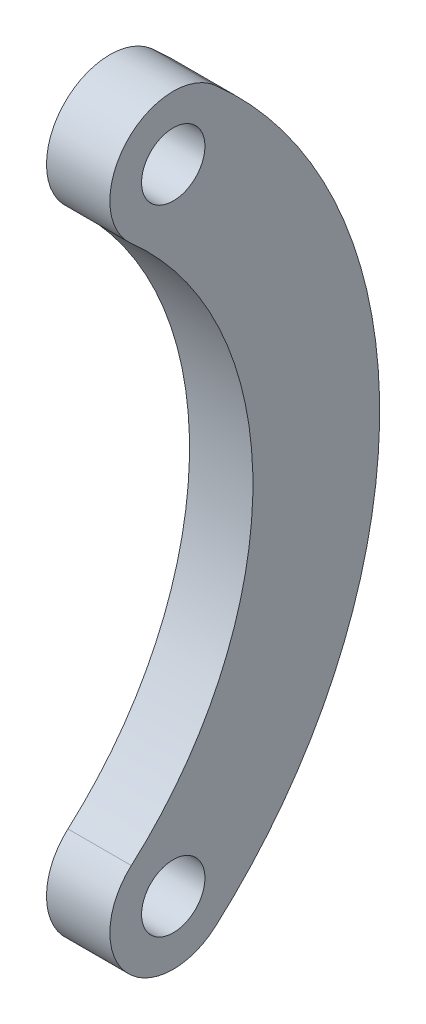
ISO-10303-21;
HEADER;
FILE_DESCRIPTION(('STEP AP214'),'2;1');
FILE_NAME('part.step','',(''),(''),'','','');
FILE_SCHEMA(('AUTOMOTIVE_DESIGN { 1 0 10303 214 1 1 1 1 }'));
ENDSEC;
DATA;
#1=APPLICATION_CONTEXT('core data for automotive mechanical design processes');
#2=APPLICATION_PROTOCOL_DEFINITION('international standard','automotive_design',2000,#1);
#3=PRODUCT_CONTEXT('',#1,'mechanical');
#4=PRODUCT('Part','Part','',(#3));
#5=PRODUCT_RELATED_PRODUCT_CATEGORY('part','',(#4));
#6=PRODUCT_DEFINITION_FORMATION('','',#4);
#7=PRODUCT_DEFINITION_CONTEXT('part definition',#1,'design');
#8=PRODUCT_DEFINITION('design','',#6,#7);
#9=PRODUCT_DEFINITION_SHAPE('','',#8);
#10=(LENGTH_UNIT() NAMED_UNIT(*) SI_UNIT(.MILLI.,.METRE.));
#11=(NAMED_UNIT(*) PLANE_ANGLE_UNIT() SI_UNIT($,.RADIAN.));
#12=(NAMED_UNIT(*) SI_UNIT($,.STERADIAN.) SOLID_ANGLE_UNIT());
#13=UNCERTAINTY_MEASURE_WITH_UNIT(LENGTH_MEASURE(1.E-05),#10,'distance_accuracy_value','');
#14=(GEOMETRIC_REPRESENTATION_CONTEXT(3) GLOBAL_UNCERTAINTY_ASSIGNED_CONTEXT((#13)) GLOBAL_UNIT_ASSIGNED_CONTEXT((#10,
#11,#12)) REPRESENTATION_CONTEXT('',''));
#15=CARTESIAN_POINT('',(0.,0.,0.));
#16=DIRECTION('',(0.,0.,1.));
#17=DIRECTION('',(1.,0.,0.));
#18=AXIS2_PLACEMENT_3D('',#15,#16,#17);
#19=CARTESIAN_POINT('',(19.05,0.,0.));
#20=DIRECTION('',(-1.,0.,0.));
#21=DIRECTION('',(0.,0.,1.));
#22=AXIS2_PLACEMENT_3D('',#19,#20,#21);
#23=CYLINDRICAL_SURFACE('',#22,146.05);
#24=CARTESIAN_POINT('',(0.,0.,0.));
#25=DIRECTION('',(1.,0.,0.));
#26=DIRECTION('',(0.,0.,-1.));
#27=AXIS2_PLACEMENT_3D('',#24,#25,#26);
#28=CIRCLE('',#27,146.05);
#29=CARTESIAN_POINT('',(0.,109.5375,-96.6029947452458));
#30=VERTEX_POINT('',#29);
#31=CARTESIAN_POINT('',(0.,-109.5375,-96.6029947452459));
#32=VERTEX_POINT('',#31);
#33=EDGE_CURVE('E122',#30,#32,#28,.F.);
#34=ORIENTED_EDGE('',*,*,#33,.F.);
#35=DIRECTION('',(-1.,0.,0.));
#36=VECTOR('',#35,1.);
#37=CARTESIAN_POINT('',(19.05,109.5375,-96.6029947452458));
#38=LINE('',#37,#36);
#39=CARTESIAN_POINT('',(19.05,109.5375,-96.6029947452458));
#40=VERTEX_POINT('',#39);
#41=EDGE_CURVE('E11',#40,#30,#38,.T.);
#42=ORIENTED_EDGE('',*,*,#41,.F.);
#43=CARTESIAN_POINT('',(19.05,0.,0.));
#44=DIRECTION('',(1.,0.,0.));
#45=DIRECTION('',(0.,0.,-1.));
#46=AXIS2_PLACEMENT_3D('',#43,#44,#45);
#47=CIRCLE('',#46,146.05);
#48=CARTESIAN_POINT('',(19.05,-109.5375,-96.6029947452459));
#49=VERTEX_POINT('',#48);
#50=EDGE_CURVE('E95',#40,#49,#47,.F.);
#51=ORIENTED_EDGE('',*,*,#50,.T.);
#52=DIRECTION('',(-1.,0.,0.));
#53=VECTOR('',#52,1.);
#54=CARTESIAN_POINT('',(19.05,-109.5375,-96.6029947452459));
#55=LINE('',#54,#53);
#56=EDGE_CURVE('E62',#49,#32,#55,.T.);
#57=ORIENTED_EDGE('',*,*,#56,.T.);
#58=EDGE_LOOP('',(#34,#42,#51,#57));
#59=FACE_BOUND('',#58,.T.);
#60=ADVANCED_FACE('F45',(#59),#23,.T.);
#61=CARTESIAN_POINT('',(19.05,95.25,-84.0026041263008));
#62=DIRECTION('',(-1.,0.,0.));
#63=DIRECTION('',(0.,0.,1.));
#64=AXIS2_PLACEMENT_3D('',#61,#62,#63);
#65=CYLINDRICAL_SURFACE('',#64,19.05);
#66=CARTESIAN_POINT('',(0.,95.25,-84.0026041263008));
#67=DIRECTION('',(1.,0.,0.));
#68=DIRECTION('',(0.,0.,-1.));
#69=AXIS2_PLACEMENT_3D('',#66,#67,#68);
#70=CIRCLE('',#69,19.05);
#71=CARTESIAN_POINT('',(0.,80.9625,-71.4022135073556));
#72=VERTEX_POINT('',#71);
#73=EDGE_CURVE('E102',#30,#72,#70,.T.);
#74=ORIENTED_EDGE('',*,*,#73,.T.);
#75=DIRECTION('',(-1.,0.,0.));
#76=VECTOR('',#75,1.);
#77=CARTESIAN_POINT('',(19.05,80.9625,-71.4022135073556));
#78=LINE('',#77,#76);
#79=CARTESIAN_POINT('',(19.05,80.9625,-71.4022135073556));
#80=VERTEX_POINT('',#79);
#81=EDGE_CURVE('E54',#80,#72,#78,.T.);
#82=ORIENTED_EDGE('',*,*,#81,.F.);
#83=CARTESIAN_POINT('',(19.05,95.25,-84.0026041263008));
#84=DIRECTION('',(1.,0.,0.));
#85=DIRECTION('',(0.,0.,-1.));
#86=AXIS2_PLACEMENT_3D('',#83,#84,#85);
#87=CIRCLE('',#86,19.05);
#88=EDGE_CURVE('E88',#40,#80,#87,.T.);
#89=ORIENTED_EDGE('',*,*,#88,.F.);
#90=ORIENTED_EDGE('',*,*,#41,.T.);
#91=EDGE_LOOP('',(#74,#82,#89,#90));
#92=FACE_BOUND('',#91,.T.);
#93=ADVANCED_FACE('F100',(#92),#65,.T.);
#94=CARTESIAN_POINT('',(19.05,0.,0.));
#95=DIRECTION('',(-1.,0.,0.));
#96=DIRECTION('',(0.,0.,1.));
#97=AXIS2_PLACEMENT_3D('',#94,#95,#96);
#98=CYLINDRICAL_SURFACE('',#97,107.95);
#99=CARTESIAN_POINT('',(0.,0.,0.));
#100=DIRECTION('',(1.,0.,0.));
#101=DIRECTION('',(0.,0.,-1.));
#102=AXIS2_PLACEMENT_3D('',#99,#100,#101);
#103=CIRCLE('',#102,107.95);
#104=CARTESIAN_POINT('',(0.,-80.9625,-71.4022135073557));
#105=VERTEX_POINT('',#104);
#106=EDGE_CURVE('E127',#72,#105,#103,.F.);
#107=ORIENTED_EDGE('',*,*,#106,.T.);
#108=DIRECTION('',(-1.,0.,0.));
#109=VECTOR('',#108,1.);
#110=CARTESIAN_POINT('',(19.05,-80.9625,-71.4022135073557));
#111=LINE('',#110,#109);
#112=CARTESIAN_POINT('',(19.05,-80.9625,-71.4022135073557));
#113=VERTEX_POINT('',#112);
#114=EDGE_CURVE('E76',#113,#105,#111,.T.);
#115=ORIENTED_EDGE('',*,*,#114,.F.);
#116=CARTESIAN_POINT('',(19.05,0.,0.));
#117=DIRECTION('',(1.,0.,0.));
#118=DIRECTION('',(0.,0.,-1.));
#119=AXIS2_PLACEMENT_3D('',#116,#117,#118);
#120=CIRCLE('',#119,107.95);
#121=EDGE_CURVE('E94',#80,#113,#120,.F.);
#122=ORIENTED_EDGE('',*,*,#121,.F.);
#123=ORIENTED_EDGE('',*,*,#81,.T.);
#124=EDGE_LOOP('',(#107,#115,#122,#123));
#125=FACE_BOUND('',#124,.T.);
#126=ADVANCED_FACE('F106',(#125),#98,.F.);
#127=CARTESIAN_POINT('',(19.05,-95.25,-84.0026041263008));
#128=DIRECTION('',(-1.,0.,0.));
#129=DIRECTION('',(0.,0.,1.));
#130=AXIS2_PLACEMENT_3D('',#127,#128,#129);
#131=CYLINDRICAL_SURFACE('',#130,9.52500000000001);
#132=CARTESIAN_POINT('',(19.05,-95.25,-84.0026041263008));
#133=DIRECTION('',(1.,0.,0.));
#134=DIRECTION('',(0.,0.,-1.));
#135=AXIS2_PLACEMENT_3D('',#132,#133,#134);
#136=CIRCLE('',#135,9.52500000000001);
#137=CARTESIAN_POINT('',(19.05,-95.25,-74.4776041263007));
#138=VERTEX_POINT('',#137);
#139=EDGE_CURVE('E111',#138,#138,#136,.T.);
#140=CARTESIAN_POINT('',(0.,-95.25,-84.0026041263008));
#141=DIRECTION('',(1.,0.,0.));
#142=DIRECTION('',(0.,0.,-1.));
#143=AXIS2_PLACEMENT_3D('',#140,#141,#142);
#144=CIRCLE('',#143,9.52500000000001);
#145=CARTESIAN_POINT('',(0.,-95.25,-74.4776041263007));
#146=VERTEX_POINT('',#145);
#147=EDGE_CURVE('E134',#146,#146,#144,.T.);
#148=CARTESIAN_POINT('',(19.05,-95.25,-74.4776041263007));
#149=CARTESIAN_POINT('',(18.8515625,-95.25,-74.4776041263007));
#150=CARTESIAN_POINT('',(18.653125,-95.25,-74.4776041263007));
#151=CARTESIAN_POINT('',(18.25625,-95.25,-74.4776041263007));
#152=CARTESIAN_POINT('',(18.0578125,-95.25,-74.4776041263007));
#153=CARTESIAN_POINT('',(17.6609375,-95.25,-74.4776041263007));
#154=CARTESIAN_POINT('',(17.4625,-95.25,-74.4776041263007));
#155=CARTESIAN_POINT('',(17.065625,-95.25,-74.4776041263007));
#156=CARTESIAN_POINT('',(16.8671875,-95.25,-74.4776041263007));
#157=CARTESIAN_POINT('',(16.4703125,-95.25,-74.4776041263007));
#158=CARTESIAN_POINT('',(16.271875,-95.25,-74.4776041263007));
#159=CARTESIAN_POINT('',(15.875,-95.25,-74.4776041263007));
#160=CARTESIAN_POINT('',(15.6765625,-95.25,-74.4776041263007));
#161=CARTESIAN_POINT('',(15.2796875,-95.25,-74.4776041263007));
#162=CARTESIAN_POINT('',(15.08125,-95.25,-74.4776041263007));
#163=CARTESIAN_POINT('',(14.684375,-95.25,-74.4776041263007));
#164=CARTESIAN_POINT('',(14.4859375,-95.25,-74.4776041263007));
#165=CARTESIAN_POINT('',(14.0890625,-95.25,-74.4776041263007));
#166=CARTESIAN_POINT('',(13.890625,-95.25,-74.4776041263007));
#167=CARTESIAN_POINT('',(13.49375,-95.25,-74.4776041263007));
#168=CARTESIAN_POINT('',(13.2953125,-95.25,-74.4776041263007));
#169=CARTESIAN_POINT('',(12.8984375,-95.25,-74.4776041263007));
#170=CARTESIAN_POINT('',(12.7,-95.25,-74.4776041263007));
#171=CARTESIAN_POINT('',(12.303125,-95.25,-74.4776041263007));
#172=CARTESIAN_POINT('',(12.1046875,-95.25,-74.4776041263007));
#173=CARTESIAN_POINT('',(11.7078125,-95.25,-74.4776041263007));
#174=CARTESIAN_POINT('',(11.509375,-95.25,-74.4776041263007));
#175=CARTESIAN_POINT('',(11.1125,-95.25,-74.4776041263007));
#176=CARTESIAN_POINT('',(10.9140625,-95.25,-74.4776041263007));
#177=CARTESIAN_POINT('',(10.5171875,-95.25,-74.4776041263007));
#178=CARTESIAN_POINT('',(10.31875,-95.25,-74.4776041263007));
#179=CARTESIAN_POINT('',(9.921875,-95.25,-74.4776041263007));
#180=CARTESIAN_POINT('',(9.7234375,-95.25,-74.4776041263007));
#181=CARTESIAN_POINT('',(9.3265625,-95.25,-74.4776041263007));
#182=CARTESIAN_POINT('',(9.128125,-95.25,-74.4776041263007));
#183=CARTESIAN_POINT('',(8.73125,-95.25,-74.4776041263007));
#184=CARTESIAN_POINT('',(8.5328125,-95.25,-74.4776041263007));
#185=CARTESIAN_POINT('',(8.1359375,-95.25,-74.4776041263007));
#186=CARTESIAN_POINT('',(7.9375,-95.25,-74.4776041263007));
#187=CARTESIAN_POINT('',(7.540625,-95.25,-74.4776041263007));
#188=CARTESIAN_POINT('',(7.3421875,-95.25,-74.4776041263007));
#189=CARTESIAN_POINT('',(6.9453125,-95.25,-74.4776041263007));
#190=CARTESIAN_POINT('',(6.746875,-95.25,-74.4776041263007));
#191=CARTESIAN_POINT('',(6.35,-95.25,-74.4776041263007));
#192=CARTESIAN_POINT('',(6.1515625,-95.25,-74.4776041263007));
#193=CARTESIAN_POINT('',(5.7546875,-95.25,-74.4776041263007));
#194=CARTESIAN_POINT('',(5.55625,-95.25,-74.4776041263007));
#195=CARTESIAN_POINT('',(5.159375,-95.25,-74.4776041263007));
#196=CARTESIAN_POINT('',(4.9609375,-95.25,-74.4776041263007));
#197=CARTESIAN_POINT('',(4.5640625,-95.25,-74.4776041263007));
#198=CARTESIAN_POINT('',(4.365625,-95.25,-74.4776041263007));
#199=CARTESIAN_POINT('',(3.96875,-95.25,-74.4776041263007));
#200=CARTESIAN_POINT('',(3.7703125,-95.25,-74.4776041263007));
#201=CARTESIAN_POINT('',(3.3734375,-95.25,-74.4776041263007));
#202=CARTESIAN_POINT('',(3.175,-95.25,-74.4776041263007));
#203=CARTESIAN_POINT('',(2.778125,-95.25,-74.4776041263007));
#204=CARTESIAN_POINT('',(2.5796875,-95.25,-74.4776041263007));
#205=CARTESIAN_POINT('',(2.1828125,-95.25,-74.4776041263007));
#206=CARTESIAN_POINT('',(1.984375,-95.25,-74.4776041263007));
#207=CARTESIAN_POINT('',(1.5875,-95.25,-74.4776041263007));
#208=CARTESIAN_POINT('',(1.3890625,-95.25,-74.4776041263007));
#209=CARTESIAN_POINT('',(0.992187500000001,-95.25,-74.4776041263007));
#210=CARTESIAN_POINT('',(0.793750000000001,-95.25,-74.4776041263007));
#211=CARTESIAN_POINT('',(0.396875,-95.25,-74.4776041263007));
#212=CARTESIAN_POINT('',(0.1984375,-95.25,-74.4776041263007));
#213=CARTESIAN_POINT('',(0.,-95.25,-74.4776041263007));
#214=B_SPLINE_CURVE_WITH_KNOTS('',3,(#148,#149,#150,#151,#152,#153,#154,#155,#156,#157,#158,
#159,#160,#161,#162,#163,#164,#165,#166,#167,#168,#169,#170,#171,#172,#173,#174,#175,#176,#177,
#178,#179,#180,#181,#182,#183,#184,#185,#186,#187,#188,#189,#190,#191,#192,#193,#194,#195,#196,
#197,#198,#199,#200,#201,#202,#203,#204,#205,#206,#207,#208,#209,#210,#211,#212,#213),
.UNSPECIFIED.,.F.,.F.,(4,2,2,2,2,2,2,2,2,2,2,2,2,2,2,2,2,2,2,2,2,2,2,2,2,2,2,2,2,2,2,2,4),(0.,
0.5953125,1.190625,1.7859375,2.38125,2.9765625,3.571875,4.1671875,4.7625,5.3578125,5.953125,
6.5484375,7.14375,7.7390625,8.334375,8.9296875,9.525,10.1203125,10.715625,11.3109375,11.90625,
12.5015625,13.096875,13.6921875,14.2875,14.8828125,15.478125,16.0734375,16.66875,17.2640625,
17.859375,18.4546875,19.05),.UNSPECIFIED.);
#215=EDGE_CURVE('BSEAM151',#138,#146,#214,.T.);
#216=ORIENTED_EDGE('',*,*,#139,.T.);
#217=ORIENTED_EDGE('',*,*,#147,.F.);
#218=ORIENTED_EDGE('',*,*,#215,.T.);
#219=ORIENTED_EDGE('',*,*,#215,.F.);
#220=EDGE_LOOP('',(#216,#218,#217,#219));
#221=FACE_BOUND('',#220,.T.);
#222=ADVANCED_FACE('F151',(#221),#131,.F.);
#223=CARTESIAN_POINT('',(19.05,-95.25,-84.0026041263008));
#224=DIRECTION('',(-1.,0.,0.));
#225=DIRECTION('',(0.,0.,1.));
#226=AXIS2_PLACEMENT_3D('',#223,#224,#225);
#227=CYLINDRICAL_SURFACE('',#226,19.05);
#228=CARTESIAN_POINT('',(0.,-95.25,-84.0026041263008));
#229=DIRECTION('',(1.,0.,0.));
#230=DIRECTION('',(0.,0.,-1.));
#231=AXIS2_PLACEMENT_3D('',#228,#229,#230);
#232=CIRCLE('',#231,19.05);
#233=EDGE_CURVE('E130',#32,#105,#232,.F.);
#234=ORIENTED_EDGE('',*,*,#233,.F.);
#235=ORIENTED_EDGE('',*,*,#56,.F.);
#236=CARTESIAN_POINT('',(19.05,-95.25,-84.0026041263008));
#237=DIRECTION('',(1.,0.,0.));
#238=DIRECTION('',(0.,0.,-1.));
#239=AXIS2_PLACEMENT_3D('',#236,#237,#238);
#240=CIRCLE('',#239,19.05);
#241=EDGE_CURVE('E108',#49,#113,#240,.F.);
#242=ORIENTED_EDGE('',*,*,#241,.T.);
#243=ORIENTED_EDGE('',*,*,#114,.T.);
#244=EDGE_LOOP('',(#234,#235,#242,#243));
#245=FACE_BOUND('',#244,.T.);
#246=ADVANCED_FACE('F148',(#245),#227,.T.);
#247=CARTESIAN_POINT('',(19.05,95.25,-84.0026041263008));
#248=DIRECTION('',(-1.,0.,0.));
#249=DIRECTION('',(0.,0.,1.));
#250=AXIS2_PLACEMENT_3D('',#247,#248,#249);
#251=CYLINDRICAL_SURFACE('',#250,9.52500000000001);
#252=CARTESIAN_POINT('',(19.05,95.25,-84.0026041263008));
#253=DIRECTION('',(1.,0.,0.));
#254=DIRECTION('',(0.,0.,-1.));
#255=AXIS2_PLACEMENT_3D('',#252,#253,#254);
#256=CIRCLE('',#255,9.52500000000001);
#257=CARTESIAN_POINT('',(19.05,95.25,-74.4776041263007));
#258=VERTEX_POINT('',#257);
#259=EDGE_CURVE('E118',#258,#258,#256,.F.);
#260=CARTESIAN_POINT('',(0.,95.25,-84.0026041263008));
#261=DIRECTION('',(1.,0.,0.));
#262=DIRECTION('',(0.,0.,-1.));
#263=AXIS2_PLACEMENT_3D('',#260,#261,#262);
#264=CIRCLE('',#263,9.52500000000001);
#265=CARTESIAN_POINT('',(0.,95.25,-74.4776041263007));
#266=VERTEX_POINT('',#265);
#267=EDGE_CURVE('E138',#266,#266,#264,.F.);
#268=CARTESIAN_POINT('',(19.05,95.25,-74.4776041263007));
#269=CARTESIAN_POINT('',(18.8515625,95.25,-74.4776041263007));
#270=CARTESIAN_POINT('',(18.653125,95.25,-74.4776041263007));
#271=CARTESIAN_POINT('',(18.25625,95.25,-74.4776041263007));
#272=CARTESIAN_POINT('',(18.0578125,95.25,-74.4776041263007));
#273=CARTESIAN_POINT('',(17.6609375,95.25,-74.4776041263007));
#274=CARTESIAN_POINT('',(17.4625,95.25,-74.4776041263007));
#275=CARTESIAN_POINT('',(17.065625,95.25,-74.4776041263007));
#276=CARTESIAN_POINT('',(16.8671875,95.25,-74.4776041263007));
#277=CARTESIAN_POINT('',(16.4703125,95.25,-74.4776041263007));
#278=CARTESIAN_POINT('',(16.271875,95.25,-74.4776041263007));
#279=CARTESIAN_POINT('',(15.875,95.25,-74.4776041263007));
#280=CARTESIAN_POINT('',(15.6765625,95.25,-74.4776041263007));
#281=CARTESIAN_POINT('',(15.2796875,95.25,-74.4776041263007));
#282=CARTESIAN_POINT('',(15.08125,95.25,-74.4776041263007));
#283=CARTESIAN_POINT('',(14.684375,95.25,-74.4776041263007));
#284=CARTESIAN_POINT('',(14.4859375,95.25,-74.4776041263007));
#285=CARTESIAN_POINT('',(14.0890625,95.25,-74.4776041263007));
#286=CARTESIAN_POINT('',(13.890625,95.25,-74.4776041263007));
#287=CARTESIAN_POINT('',(13.49375,95.25,-74.4776041263007));
#288=CARTESIAN_POINT('',(13.2953125,95.25,-74.4776041263007));
#289=CARTESIAN_POINT('',(12.8984375,95.25,-74.4776041263007));
#290=CARTESIAN_POINT('',(12.7,95.25,-74.4776041263007));
#291=CARTESIAN_POINT('',(12.303125,95.25,-74.4776041263007));
#292=CARTESIAN_POINT('',(12.1046875,95.25,-74.4776041263007));
#293=CARTESIAN_POINT('',(11.7078125,95.25,-74.4776041263007));
#294=CARTESIAN_POINT('',(11.509375,95.25,-74.4776041263007));
#295=CARTESIAN_POINT('',(11.1125,95.25,-74.4776041263007));
#296=CARTESIAN_POINT('',(10.9140625,95.25,-74.4776041263007));
#297=CARTESIAN_POINT('',(10.5171875,95.25,-74.4776041263007));
#298=CARTESIAN_POINT('',(10.31875,95.25,-74.4776041263007));
#299=CARTESIAN_POINT('',(9.921875,95.25,-74.4776041263007));
#300=CARTESIAN_POINT('',(9.7234375,95.25,-74.4776041263007));
#301=CARTESIAN_POINT('',(9.3265625,95.25,-74.4776041263007));
#302=CARTESIAN_POINT('',(9.128125,95.25,-74.4776041263007));
#303=CARTESIAN_POINT('',(8.73125,95.25,-74.4776041263007));
#304=CARTESIAN_POINT('',(8.5328125,95.25,-74.4776041263007));
#305=CARTESIAN_POINT('',(8.1359375,95.25,-74.4776041263007));
#306=CARTESIAN_POINT('',(7.9375,95.25,-74.4776041263007));
#307=CARTESIAN_POINT('',(7.540625,95.25,-74.4776041263007));
#308=CARTESIAN_POINT('',(7.3421875,95.25,-74.4776041263007));
#309=CARTESIAN_POINT('',(6.9453125,95.25,-74.4776041263007));
#310=CARTESIAN_POINT('',(6.746875,95.25,-74.4776041263007));
#311=CARTESIAN_POINT('',(6.35,95.25,-74.4776041263007));
#312=CARTESIAN_POINT('',(6.1515625,95.25,-74.4776041263007));
#313=CARTESIAN_POINT('',(5.7546875,95.25,-74.4776041263007));
#314=CARTESIAN_POINT('',(5.55625,95.25,-74.4776041263007));
#315=CARTESIAN_POINT('',(5.159375,95.25,-74.4776041263007));
#316=CARTESIAN_POINT('',(4.9609375,95.25,-74.4776041263007));
#317=CARTESIAN_POINT('',(4.5640625,95.25,-74.4776041263007));
#318=CARTESIAN_POINT('',(4.365625,95.25,-74.4776041263007));
#319=CARTESIAN_POINT('',(3.96875,95.25,-74.4776041263007));
#320=CARTESIAN_POINT('',(3.7703125,95.25,-74.4776041263007));
#321=CARTESIAN_POINT('',(3.3734375,95.25,-74.4776041263007));
#322=CARTESIAN_POINT('',(3.175,95.25,-74.4776041263007));
#323=CARTESIAN_POINT('',(2.778125,95.25,-74.4776041263007));
#324=CARTESIAN_POINT('',(2.5796875,95.25,-74.4776041263007));
#325=CARTESIAN_POINT('',(2.1828125,95.25,-74.4776041263007));
#326=CARTESIAN_POINT('',(1.984375,95.25,-74.4776041263007));
#327=CARTESIAN_POINT('',(1.5875,95.25,-74.4776041263007));
#328=CARTESIAN_POINT('',(1.3890625,95.25,-74.4776041263007));
#329=CARTESIAN_POINT('',(0.992187500000001,95.25,-74.4776041263007));
#330=CARTESIAN_POINT('',(0.793750000000001,95.25,-74.4776041263007));
#331=CARTESIAN_POINT('',(0.396875,95.25,-74.4776041263007));
#332=CARTESIAN_POINT('',(0.1984375,95.25,-74.4776041263007));
#333=CARTESIAN_POINT('',(0.,95.25,-74.4776041263007));
#334=B_SPLINE_CURVE_WITH_KNOTS('',3,(#268,#269,#270,#271,#272,#273,#274,#275,#276,#277,#278,
#279,#280,#281,#282,#283,#284,#285,#286,#287,#288,#289,#290,#291,#292,#293,#294,#295,#296,#297,
#298,#299,#300,#301,#302,#303,#304,#305,#306,#307,#308,#309,#310,#311,#312,#313,#314,#315,#316,
#317,#318,#319,#320,#321,#322,#323,#324,#325,#326,#327,#328,#329,#330,#331,#332,#333),
.UNSPECIFIED.,.F.,.F.,(4,2,2,2,2,2,2,2,2,2,2,2,2,2,2,2,2,2,2,2,2,2,2,2,2,2,2,2,2,2,2,2,4),(0.,
0.5953125,1.190625,1.7859375,2.38125,2.9765625,3.571875,4.1671875,4.7625,5.3578125,5.953125,
6.5484375,7.14375,7.7390625,8.334375,8.9296875,9.525,10.1203125,10.715625,11.3109375,11.90625,
12.5015625,13.096875,13.6921875,14.2875,14.8828125,15.478125,16.0734375,16.66875,17.2640625,
17.859375,18.4546875,19.05),.UNSPECIFIED.);
#335=EDGE_CURVE('BSEAM150',#258,#266,#334,.T.);
#336=ORIENTED_EDGE('',*,*,#259,.F.);
#337=ORIENTED_EDGE('',*,*,#267,.T.);
#338=ORIENTED_EDGE('',*,*,#335,.T.);
#339=ORIENTED_EDGE('',*,*,#335,.F.);
#340=EDGE_LOOP('',(#336,#338,#337,#339));
#341=FACE_BOUND('',#340,.T.);
#342=ADVANCED_FACE('F150',(#341),#251,.F.);
#343=CARTESIAN_POINT('',(19.05,0.,0.));
#344=DIRECTION('',(1.,0.,0.));
#345=DIRECTION('',(0.,0.,-1.));
#346=AXIS2_PLACEMENT_3D('',#343,#344,#345);
#347=PLANE('',#346);
#348=ORIENTED_EDGE('',*,*,#50,.F.);
#349=ORIENTED_EDGE('',*,*,#88,.T.);
#350=ORIENTED_EDGE('',*,*,#121,.T.);
#351=ORIENTED_EDGE('',*,*,#241,.F.);
#352=EDGE_LOOP('',(#348,#349,#350,#351));
#353=FACE_BOUND('',#352,.T.);
#354=ORIENTED_EDGE('',*,*,#139,.F.);
#355=EDGE_LOOP('',(#354));
#356=FACE_BOUND('',#355,.T.);
#357=ORIENTED_EDGE('',*,*,#259,.T.);
#358=EDGE_LOOP('',(#357));
#359=FACE_BOUND('',#358,.T.);
#360=ADVANCED_FACE('F90',(#353,#356,#359),#347,.T.);
#361=CARTESIAN_POINT('',(0.,0.,0.));
#362=DIRECTION('',(1.,0.,0.));
#363=DIRECTION('',(0.,0.,-1.));
#364=AXIS2_PLACEMENT_3D('',#361,#362,#363);
#365=PLANE('',#364);
#366=ORIENTED_EDGE('',*,*,#33,.T.);
#367=ORIENTED_EDGE('',*,*,#233,.T.);
#368=ORIENTED_EDGE('',*,*,#106,.F.);
#369=ORIENTED_EDGE('',*,*,#73,.F.);
#370=EDGE_LOOP('',(#366,#367,#368,#369));
#371=FACE_BOUND('',#370,.T.);
#372=ORIENTED_EDGE('',*,*,#147,.T.);
#373=EDGE_LOOP('',(#372));
#374=FACE_BOUND('',#373,.T.);
#375=ORIENTED_EDGE('',*,*,#267,.F.);
#376=EDGE_LOOP('',(#375));
#377=FACE_BOUND('',#376,.T.);
#378=ADVANCED_FACE('F196',(#371,#374,#377),#365,.F.);
#379=CLOSED_SHELL('',(#60,#93,#126,#222,#246,#342,#360,#378));
#380=MANIFOLD_SOLID_BREP('B2',#379);
#381=ADVANCED_BREP_SHAPE_REPRESENTATION('',(#18,#380),#14);
#382=SHAPE_DEFINITION_REPRESENTATION(#9,#381);
ENDSEC;
END-ISO-10303-21;
